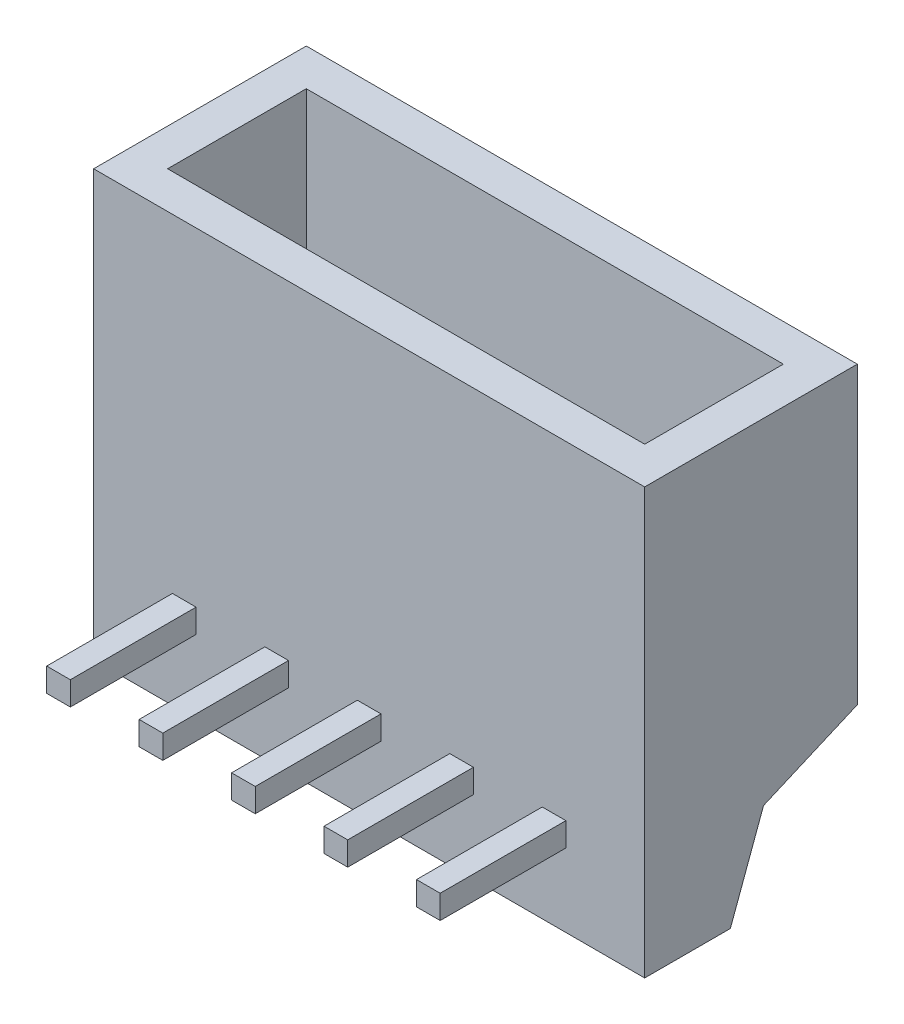
ISO-10303-21;
HEADER;
FILE_DESCRIPTION(('STEP AP214'),'2;1');
FILE_NAME('part.step','',(''),(''),'','','');
FILE_SCHEMA(('AUTOMOTIVE_DESIGN { 1 0 10303 214 1 1 1 1 }'));
ENDSEC;
DATA;
#1=APPLICATION_CONTEXT('core data for automotive mechanical design processes');
#2=APPLICATION_PROTOCOL_DEFINITION('international standard','automotive_design',2000,#1);
#3=PRODUCT_CONTEXT('',#1,'mechanical');
#4=PRODUCT('Part','Part','',(#3));
#5=PRODUCT_RELATED_PRODUCT_CATEGORY('part','',(#4));
#6=PRODUCT_DEFINITION_FORMATION('','',#4);
#7=PRODUCT_DEFINITION_CONTEXT('part definition',#1,'design');
#8=PRODUCT_DEFINITION('design','',#6,#7);
#9=PRODUCT_DEFINITION_SHAPE('','',#8);
#10=(LENGTH_UNIT() NAMED_UNIT(*) SI_UNIT(.MILLI.,.METRE.));
#11=(NAMED_UNIT(*) PLANE_ANGLE_UNIT() SI_UNIT($,.RADIAN.));
#12=(NAMED_UNIT(*) SI_UNIT($,.STERADIAN.) SOLID_ANGLE_UNIT());
#13=UNCERTAINTY_MEASURE_WITH_UNIT(LENGTH_MEASURE(1.E-05),#10,'distance_accuracy_value','');
#14=(GEOMETRIC_REPRESENTATION_CONTEXT(3) GLOBAL_UNCERTAINTY_ASSIGNED_CONTEXT((#13)) GLOBAL_UNIT_ASSIGNED_CONTEXT((#10,
#11,#12)) REPRESENTATION_CONTEXT('',''));
#15=CARTESIAN_POINT('',(0.,0.,0.));
#16=DIRECTION('',(0.,0.,1.));
#17=DIRECTION('',(1.,0.,0.));
#18=AXIS2_PLACEMENT_3D('',#15,#16,#17);
#19=CARTESIAN_POINT('',(0.,0.,5.75));
#20=DIRECTION('',(0.,0.,-1.));
#21=DIRECTION('',(-1.,0.,0.));
#22=AXIS2_PLACEMENT_3D('',#19,#20,#21);
#23=PLANE('',#22);
#24=DIRECTION('',(0.,-1.,0.));
#25=VECTOR('',#24,1.);
#26=CARTESIAN_POINT('',(9.63,1.98,5.75));
#27=LINE('',#26,#25);
#28=CARTESIAN_POINT('',(9.63,2.62,5.75));
#29=VERTEX_POINT('',#28);
#30=CARTESIAN_POINT('',(9.63,1.98,5.75));
#31=VERTEX_POINT('',#30);
#32=EDGE_CURVE('E318',#29,#31,#27,.T.);
#33=ORIENTED_EDGE('',*,*,#32,.F.);
#34=DIRECTION('',(-1.,0.,0.));
#35=VECTOR('',#34,1.);
#36=CARTESIAN_POINT('',(9.63,2.62,5.75));
#37=LINE('',#36,#35);
#38=CARTESIAN_POINT('',(10.27,2.62,5.75));
#39=VERTEX_POINT('',#38);
#40=EDGE_CURVE('E323',#39,#29,#37,.T.);
#41=ORIENTED_EDGE('',*,*,#40,.F.);
#42=DIRECTION('',(0.,1.,0.));
#43=VECTOR('',#42,1.);
#44=CARTESIAN_POINT('',(10.27,1.98,5.75));
#45=LINE('',#44,#43);
#46=CARTESIAN_POINT('',(10.27,1.98,5.75));
#47=VERTEX_POINT('',#46);
#48=EDGE_CURVE('E335',#47,#39,#45,.T.);
#49=ORIENTED_EDGE('',*,*,#48,.F.);
#50=DIRECTION('',(1.,0.,0.));
#51=VECTOR('',#50,1.);
#52=CARTESIAN_POINT('',(9.63,1.98,5.75));
#53=LINE('',#52,#51);
#54=EDGE_CURVE('E332',#31,#47,#53,.T.);
#55=ORIENTED_EDGE('',*,*,#54,.F.);
#56=EDGE_LOOP('',(#33,#41,#49,#55));
#57=FACE_BOUND('',#56,.T.);
#58=DIRECTION('',(0.,-1.,0.));
#59=VECTOR('',#58,1.);
#60=CARTESIAN_POINT('',(4.63,1.98,5.75));
#61=LINE('',#60,#59);
#62=CARTESIAN_POINT('',(4.63,2.62,5.75));
#63=VERTEX_POINT('',#62);
#64=CARTESIAN_POINT('',(4.63,1.98,5.75));
#65=VERTEX_POINT('',#64);
#66=EDGE_CURVE('E384',#63,#65,#61,.T.);
#67=ORIENTED_EDGE('',*,*,#66,.F.);
#68=DIRECTION('',(-1.,0.,0.));
#69=VECTOR('',#68,1.);
#70=CARTESIAN_POINT('',(4.63,2.62,5.75));
#71=LINE('',#70,#69);
#72=CARTESIAN_POINT('',(5.27,2.62,5.75));
#73=VERTEX_POINT('',#72);
#74=EDGE_CURVE('E389',#73,#63,#71,.T.);
#75=ORIENTED_EDGE('',*,*,#74,.F.);
#76=DIRECTION('',(0.,1.,0.));
#77=VECTOR('',#76,1.);
#78=CARTESIAN_POINT('',(5.27,1.98,5.75));
#79=LINE('',#78,#77);
#80=CARTESIAN_POINT('',(5.27,1.98,5.75));
#81=VERTEX_POINT('',#80);
#82=EDGE_CURVE('E401',#81,#73,#79,.T.);
#83=ORIENTED_EDGE('',*,*,#82,.F.);
#84=DIRECTION('',(1.,0.,0.));
#85=VECTOR('',#84,1.);
#86=CARTESIAN_POINT('',(4.63,1.98,5.75));
#87=LINE('',#86,#85);
#88=EDGE_CURVE('E398',#65,#81,#87,.T.);
#89=ORIENTED_EDGE('',*,*,#88,.F.);
#90=EDGE_LOOP('',(#67,#75,#83,#89));
#91=FACE_BOUND('',#90,.T.);
#92=DIRECTION('',(0.,-1.,0.));
#93=VECTOR('',#92,1.);
#94=CARTESIAN_POINT('',(0.,0.,5.75));
#95=LINE('',#94,#93);
#96=CARTESIAN_POINT('',(0.,11.5,5.75));
#97=VERTEX_POINT('',#96);
#98=CARTESIAN_POINT('',(0.,0.,5.75));
#99=VERTEX_POINT('',#98);
#100=EDGE_CURVE('E451',#97,#99,#95,.T.);
#101=ORIENTED_EDGE('',*,*,#100,.T.);
#102=DIRECTION('',(1.,0.,0.));
#103=VECTOR('',#102,1.);
#104=CARTESIAN_POINT('',(0.,0.,5.75));
#105=LINE('',#104,#103);
#106=CARTESIAN_POINT('',(14.9,0.,5.75));
#107=VERTEX_POINT('',#106);
#108=EDGE_CURVE('E454',#99,#107,#105,.T.);
#109=ORIENTED_EDGE('',*,*,#108,.T.);
#110=DIRECTION('',(0.,1.,0.));
#111=VECTOR('',#110,1.);
#112=CARTESIAN_POINT('',(14.9,0.,5.75));
#113=LINE('',#112,#111);
#114=CARTESIAN_POINT('',(14.9,11.5,5.75));
#115=VERTEX_POINT('',#114);
#116=EDGE_CURVE('E457',#107,#115,#113,.T.);
#117=ORIENTED_EDGE('',*,*,#116,.T.);
#118=DIRECTION('',(-1.,0.,0.));
#119=VECTOR('',#118,1.);
#120=CARTESIAN_POINT('',(0.,11.5,5.75));
#121=LINE('',#120,#119);
#122=EDGE_CURVE('E459',#115,#97,#121,.T.);
#123=ORIENTED_EDGE('',*,*,#122,.T.);
#124=EDGE_LOOP('',(#101,#109,#117,#123));
#125=FACE_BOUND('',#124,.T.);
#126=DIRECTION('',(0.,-1.,0.));
#127=VECTOR('',#126,1.);
#128=CARTESIAN_POINT('',(2.13,1.98,5.75));
#129=LINE('',#128,#127);
#130=CARTESIAN_POINT('',(2.13,2.62,5.75));
#131=VERTEX_POINT('',#130);
#132=CARTESIAN_POINT('',(2.13,1.98,5.75));
#133=VERTEX_POINT('',#132);
#134=EDGE_CURVE('E417',#131,#133,#129,.T.);
#135=ORIENTED_EDGE('',*,*,#134,.F.);
#136=DIRECTION('',(-1.,0.,0.));
#137=VECTOR('',#136,1.);
#138=CARTESIAN_POINT('',(2.13,2.62,5.75));
#139=LINE('',#138,#137);
#140=CARTESIAN_POINT('',(2.77,2.62,5.75));
#141=VERTEX_POINT('',#140);
#142=EDGE_CURVE('E422',#141,#131,#139,.T.);
#143=ORIENTED_EDGE('',*,*,#142,.F.);
#144=DIRECTION('',(0.,1.,0.));
#145=VECTOR('',#144,1.);
#146=CARTESIAN_POINT('',(2.77,1.98,5.75));
#147=LINE('',#146,#145);
#148=CARTESIAN_POINT('',(2.77,1.98,5.75));
#149=VERTEX_POINT('',#148);
#150=EDGE_CURVE('E434',#149,#141,#147,.T.);
#151=ORIENTED_EDGE('',*,*,#150,.F.);
#152=DIRECTION('',(1.,0.,0.));
#153=VECTOR('',#152,1.);
#154=CARTESIAN_POINT('',(2.13,1.98,5.75));
#155=LINE('',#154,#153);
#156=EDGE_CURVE('E431',#133,#149,#155,.T.);
#157=ORIENTED_EDGE('',*,*,#156,.F.);
#158=EDGE_LOOP('',(#135,#143,#151,#157));
#159=FACE_BOUND('',#158,.T.);
#160=DIRECTION('',(0.,-1.,0.));
#161=VECTOR('',#160,1.);
#162=CARTESIAN_POINT('',(7.13,1.98,5.75));
#163=LINE('',#162,#161);
#164=CARTESIAN_POINT('',(7.13,2.62,5.75));
#165=VERTEX_POINT('',#164);
#166=CARTESIAN_POINT('',(7.13,1.98,5.75));
#167=VERTEX_POINT('',#166);
#168=EDGE_CURVE('E351',#165,#167,#163,.T.);
#169=ORIENTED_EDGE('',*,*,#168,.F.);
#170=DIRECTION('',(-1.,0.,0.));
#171=VECTOR('',#170,1.);
#172=CARTESIAN_POINT('',(7.13,2.62,5.75));
#173=LINE('',#172,#171);
#174=CARTESIAN_POINT('',(7.77,2.62,5.75));
#175=VERTEX_POINT('',#174);
#176=EDGE_CURVE('E356',#175,#165,#173,.T.);
#177=ORIENTED_EDGE('',*,*,#176,.F.);
#178=DIRECTION('',(0.,1.,0.));
#179=VECTOR('',#178,1.);
#180=CARTESIAN_POINT('',(7.77,1.98,5.75));
#181=LINE('',#180,#179);
#182=CARTESIAN_POINT('',(7.77,1.98,5.75));
#183=VERTEX_POINT('',#182);
#184=EDGE_CURVE('E368',#183,#175,#181,.T.);
#185=ORIENTED_EDGE('',*,*,#184,.F.);
#186=DIRECTION('',(1.,0.,0.));
#187=VECTOR('',#186,1.);
#188=CARTESIAN_POINT('',(7.13,1.98,5.75));
#189=LINE('',#188,#187);
#190=EDGE_CURVE('E365',#167,#183,#189,.T.);
#191=ORIENTED_EDGE('',*,*,#190,.F.);
#192=EDGE_LOOP('',(#169,#177,#185,#191));
#193=FACE_BOUND('',#192,.T.);
#194=DIRECTION('',(0.,-1.,0.));
#195=VECTOR('',#194,1.);
#196=CARTESIAN_POINT('',(12.13,1.98,5.75));
#197=LINE('',#196,#195);
#198=CARTESIAN_POINT('',(12.13,2.62,5.75));
#199=VERTEX_POINT('',#198);
#200=CARTESIAN_POINT('',(12.13,1.98,5.75));
#201=VERTEX_POINT('',#200);
#202=EDGE_CURVE('E282',#199,#201,#197,.T.);
#203=ORIENTED_EDGE('',*,*,#202,.F.);
#204=DIRECTION('',(-1.,0.,0.));
#205=VECTOR('',#204,1.);
#206=CARTESIAN_POINT('',(12.13,2.62,5.75));
#207=LINE('',#206,#205);
#208=CARTESIAN_POINT('',(12.77,2.62,5.75));
#209=VERTEX_POINT('',#208);
#210=EDGE_CURVE('E290',#209,#199,#207,.T.);
#211=ORIENTED_EDGE('',*,*,#210,.F.);
#212=DIRECTION('',(0.,1.,0.));
#213=VECTOR('',#212,1.);
#214=CARTESIAN_POINT('',(12.77,1.98,5.75));
#215=LINE('',#214,#213);
#216=CARTESIAN_POINT('',(12.77,1.98,5.75));
#217=VERTEX_POINT('',#216);
#218=EDGE_CURVE('E302',#217,#209,#215,.T.);
#219=ORIENTED_EDGE('',*,*,#218,.F.);
#220=DIRECTION('',(1.,0.,0.));
#221=VECTOR('',#220,1.);
#222=CARTESIAN_POINT('',(12.13,1.98,5.75));
#223=LINE('',#222,#221);
#224=EDGE_CURVE('E299',#201,#217,#223,.T.);
#225=ORIENTED_EDGE('',*,*,#224,.F.);
#226=EDGE_LOOP('',(#203,#211,#219,#225));
#227=FACE_BOUND('',#226,.T.);
#228=ADVANCED_FACE('F34',(#57,#91,#125,#159,#193,#227),#23,.F.);
#229=CARTESIAN_POINT('',(0.,0.,5.75));
#230=DIRECTION('',(1.,0.,0.));
#231=DIRECTION('',(0.,0.,-1.));
#232=AXIS2_PLACEMENT_3D('',#229,#230,#231);
#233=PLANE('',#232);
#234=DIRECTION('',(0.,-1.,0.));
#235=VECTOR('',#234,1.);
#236=CARTESIAN_POINT('',(0.,0.,0.));
#237=LINE('',#236,#235);
#238=CARTESIAN_POINT('',(0.,11.5,0.));
#239=VERTEX_POINT('',#238);
#240=CARTESIAN_POINT('',(0.,3.52380686471601,0.));
#241=VERTEX_POINT('',#240);
#242=EDGE_CURVE('E450',#239,#241,#237,.T.);
#243=ORIENTED_EDGE('',*,*,#242,.T.);
#244=DIRECTION('',(0.,0.395661660405739,-0.918396347164433));
#245=VECTOR('',#244,1.);
#246=CARTESIAN_POINT('',(0.,3.52380686471601,0.));
#247=LINE('',#246,#245);
#248=CARTESIAN_POINT('',(0.,2.43109668109673,2.53636159772523));
#249=VERTEX_POINT('',#248);
#250=EDGE_CURVE('E57',#249,#241,#247,.T.);
#251=ORIENTED_EDGE('',*,*,#250,.F.);
#252=DIRECTION('',(0.,0.938176049237479,-0.346158490632768));
#253=VECTOR('',#252,1.);
#254=CARTESIAN_POINT('',(0.,2.43109668109673,2.53636159772523));
#255=LINE('',#254,#253);
#256=CARTESIAN_POINT('',(0.,0.,3.43336249472613));
#257=VERTEX_POINT('',#256);
#258=EDGE_CURVE('E266',#257,#249,#255,.T.);
#259=ORIENTED_EDGE('',*,*,#258,.F.);
#260=DIRECTION('',(0.,0.,-1.));
#261=VECTOR('',#260,1.);
#262=CARTESIAN_POINT('',(0.,0.,5.75));
#263=LINE('',#262,#261);
#264=EDGE_CURVE('E11',#99,#257,#263,.T.);
#265=ORIENTED_EDGE('',*,*,#264,.F.);
#266=ORIENTED_EDGE('',*,*,#100,.F.);
#267=DIRECTION('',(0.,0.,-1.));
#268=VECTOR('',#267,1.);
#269=CARTESIAN_POINT('',(0.,11.5,5.75));
#270=LINE('',#269,#268);
#271=EDGE_CURVE('E461',#97,#239,#270,.T.);
#272=ORIENTED_EDGE('',*,*,#271,.T.);
#273=EDGE_LOOP('',(#243,#251,#259,#265,#266,#272));
#274=FACE_BOUND('',#273,.T.);
#275=ADVANCED_FACE('F36',(#274),#233,.F.);
#276=CARTESIAN_POINT('',(0.,0.,5.75));
#277=DIRECTION('',(0.,1.,0.));
#278=DIRECTION('',(0.,0.,1.));
#279=AXIS2_PLACEMENT_3D('',#276,#277,#278);
#280=PLANE('',#279);
#281=ORIENTED_EDGE('',*,*,#264,.T.);
#282=DIRECTION('',(-1.,0.,0.));
#283=VECTOR('',#282,1.);
#284=CARTESIAN_POINT('',(14.9,0.,3.43336249472613));
#285=LINE('',#284,#283);
#286=CARTESIAN_POINT('',(14.9,0.,3.43336249472613));
#287=VERTEX_POINT('',#286);
#288=EDGE_CURVE('E276',#287,#257,#285,.T.);
#289=ORIENTED_EDGE('',*,*,#288,.F.);
#290=DIRECTION('',(0.,0.,-1.));
#291=VECTOR('',#290,1.);
#292=CARTESIAN_POINT('',(14.9,0.,5.75));
#293=LINE('',#292,#291);
#294=EDGE_CURVE('E42',#107,#287,#293,.T.);
#295=ORIENTED_EDGE('',*,*,#294,.F.);
#296=ORIENTED_EDGE('',*,*,#108,.F.);
#297=EDGE_LOOP('',(#281,#289,#295,#296));
#298=FACE_BOUND('',#297,.T.);
#299=ADVANCED_FACE('F479',(#298),#280,.F.);
#300=CARTESIAN_POINT('',(14.9,0.,5.75));
#301=DIRECTION('',(-1.,0.,0.));
#302=DIRECTION('',(0.,0.,1.));
#303=AXIS2_PLACEMENT_3D('',#300,#301,#302);
#304=PLANE('',#303);
#305=DIRECTION('',(0.,0.938176049237479,-0.346158490632768));
#306=VECTOR('',#305,1.);
#307=CARTESIAN_POINT('',(14.9,2.43109668109673,2.53636159772523));
#308=LINE('',#307,#306);
#309=CARTESIAN_POINT('',(14.9,2.43109668109673,2.53636159772523));
#310=VERTEX_POINT('',#309);
#311=EDGE_CURVE('E270',#287,#310,#308,.T.);
#312=ORIENTED_EDGE('',*,*,#311,.T.);
#313=DIRECTION('',(0.,0.395661660405739,-0.918396347164433));
#314=VECTOR('',#313,1.);
#315=CARTESIAN_POINT('',(14.9,3.52380686471601,0.));
#316=LINE('',#315,#314);
#317=CARTESIAN_POINT('',(14.9,3.52380686471601,0.));
#318=VERTEX_POINT('',#317);
#319=EDGE_CURVE('E273',#310,#318,#316,.T.);
#320=ORIENTED_EDGE('',*,*,#319,.T.);
#321=DIRECTION('',(0.,1.,0.));
#322=VECTOR('',#321,1.);
#323=CARTESIAN_POINT('',(14.9,0.,0.));
#324=LINE('',#323,#322);
#325=CARTESIAN_POINT('',(14.9,11.5,0.));
#326=VERTEX_POINT('',#325);
#327=EDGE_CURVE('E464',#318,#326,#324,.T.);
#328=ORIENTED_EDGE('',*,*,#327,.T.);
#329=DIRECTION('',(0.,0.,-1.));
#330=VECTOR('',#329,1.);
#331=CARTESIAN_POINT('',(14.9,11.5,5.75));
#332=LINE('',#331,#330);
#333=EDGE_CURVE('E469',#115,#326,#332,.T.);
#334=ORIENTED_EDGE('',*,*,#333,.F.);
#335=ORIENTED_EDGE('',*,*,#116,.F.);
#336=ORIENTED_EDGE('',*,*,#294,.T.);
#337=EDGE_LOOP('',(#312,#320,#328,#334,#335,#336));
#338=FACE_BOUND('',#337,.T.);
#339=ADVANCED_FACE('F475',(#338),#304,.F.);
#340=CARTESIAN_POINT('',(0.,11.5,5.75));
#341=DIRECTION('',(0.,-1.,0.));
#342=DIRECTION('',(0.,0.,-1.));
#343=AXIS2_PLACEMENT_3D('',#340,#341,#342);
#344=PLANE('',#343);
#345=DIRECTION('',(-1.,0.,0.));
#346=VECTOR('',#345,1.);
#347=CARTESIAN_POINT('',(13.9,11.5,1.));
#348=LINE('',#347,#346);
#349=CARTESIAN_POINT('',(13.9,11.5,1.));
#350=VERTEX_POINT('',#349);
#351=CARTESIAN_POINT('',(1.,11.5,1.));
#352=VERTEX_POINT('',#351);
#353=EDGE_CURVE('E260',#350,#352,#348,.T.);
#354=ORIENTED_EDGE('',*,*,#353,.F.);
#355=DIRECTION('',(0.,0.,-1.));
#356=VECTOR('',#355,1.);
#357=CARTESIAN_POINT('',(13.9,11.5,4.75));
#358=LINE('',#357,#356);
#359=CARTESIAN_POINT('',(13.9,11.5,4.75));
#360=VERTEX_POINT('',#359);
#361=EDGE_CURVE('E49',#360,#350,#358,.T.);
#362=ORIENTED_EDGE('',*,*,#361,.F.);
#363=DIRECTION('',(1.,0.,0.));
#364=VECTOR('',#363,1.);
#365=CARTESIAN_POINT('',(1.,11.5,4.75));
#366=LINE('',#365,#364);
#367=CARTESIAN_POINT('',(1.,11.5,4.75));
#368=VERTEX_POINT('',#367);
#369=EDGE_CURVE('E251',#368,#360,#366,.T.);
#370=ORIENTED_EDGE('',*,*,#369,.F.);
#371=DIRECTION('',(0.,0.,1.));
#372=VECTOR('',#371,1.);
#373=CARTESIAN_POINT('',(1.,11.5,1.));
#374=LINE('',#373,#372);
#375=EDGE_CURVE('E254',#352,#368,#374,.T.);
#376=ORIENTED_EDGE('',*,*,#375,.F.);
#377=EDGE_LOOP('',(#354,#362,#370,#376));
#378=FACE_BOUND('',#377,.T.);
#379=DIRECTION('',(-1.,0.,0.));
#380=VECTOR('',#379,1.);
#381=CARTESIAN_POINT('',(0.,11.5,0.));
#382=LINE('',#381,#380);
#383=EDGE_CURVE('E455',#326,#239,#382,.T.);
#384=ORIENTED_EDGE('',*,*,#383,.T.);
#385=ORIENTED_EDGE('',*,*,#271,.F.);
#386=ORIENTED_EDGE('',*,*,#122,.F.);
#387=ORIENTED_EDGE('',*,*,#333,.T.);
#388=EDGE_LOOP('',(#384,#385,#386,#387));
#389=FACE_BOUND('',#388,.T.);
#390=ADVANCED_FACE('F496',(#378,#389),#344,.F.);
#391=CARTESIAN_POINT('',(0.,0.,0.));
#392=DIRECTION('',(0.,0.,-1.));
#393=DIRECTION('',(-1.,0.,0.));
#394=AXIS2_PLACEMENT_3D('',#391,#392,#393);
#395=PLANE('',#394);
#396=DIRECTION('',(-1.,0.,0.));
#397=VECTOR('',#396,1.);
#398=CARTESIAN_POINT('',(14.9,3.52380686471601,0.));
#399=LINE('',#398,#397);
#400=EDGE_CURVE('E280',#318,#241,#399,.T.);
#401=ORIENTED_EDGE('',*,*,#400,.T.);
#402=ORIENTED_EDGE('',*,*,#242,.F.);
#403=ORIENTED_EDGE('',*,*,#383,.F.);
#404=ORIENTED_EDGE('',*,*,#327,.F.);
#405=EDGE_LOOP('',(#401,#402,#403,#404));
#406=FACE_BOUND('',#405,.T.);
#407=ADVANCED_FACE('F490',(#406),#395,.T.);
#408=CARTESIAN_POINT('',(2.13,1.98,9.15));
#409=DIRECTION('',(1.,0.,0.));
#410=DIRECTION('',(0.,0.,-1.));
#411=AXIS2_PLACEMENT_3D('',#408,#409,#410);
#412=PLANE('',#411);
#413=ORIENTED_EDGE('',*,*,#134,.T.);
#414=DIRECTION('',(0.,0.,-1.));
#415=VECTOR('',#414,1.);
#416=CARTESIAN_POINT('',(2.13,1.98,9.15));
#417=LINE('',#416,#415);
#418=CARTESIAN_POINT('',(2.13,1.98,9.15));
#419=VERTEX_POINT('',#418);
#420=EDGE_CURVE('E447',#419,#133,#417,.T.);
#421=ORIENTED_EDGE('',*,*,#420,.F.);
#422=DIRECTION('',(0.,-1.,0.));
#423=VECTOR('',#422,1.);
#424=CARTESIAN_POINT('',(2.13,1.98,9.15));
#425=LINE('',#424,#423);
#426=CARTESIAN_POINT('',(2.13,2.62,9.15));
#427=VERTEX_POINT('',#426);
#428=EDGE_CURVE('E418',#427,#419,#425,.T.);
#429=ORIENTED_EDGE('',*,*,#428,.F.);
#430=DIRECTION('',(0.,0.,-1.));
#431=VECTOR('',#430,1.);
#432=CARTESIAN_POINT('',(2.13,2.62,9.15));
#433=LINE('',#432,#431);
#434=EDGE_CURVE('E428',#427,#131,#433,.T.);
#435=ORIENTED_EDGE('',*,*,#434,.T.);
#436=EDGE_LOOP('',(#413,#421,#429,#435));
#437=FACE_BOUND('',#436,.T.);
#438=ADVANCED_FACE('F606',(#437),#412,.F.);
#439=CARTESIAN_POINT('',(2.13,1.98,9.15));
#440=DIRECTION('',(0.,1.,0.));
#441=DIRECTION('',(-1.,0.,0.));
#442=AXIS2_PLACEMENT_3D('',#439,#440,#441);
#443=PLANE('',#442);
#444=ORIENTED_EDGE('',*,*,#156,.T.);
#445=DIRECTION('',(0.,0.,-1.));
#446=VECTOR('',#445,1.);
#447=CARTESIAN_POINT('',(2.77,1.98,9.15));
#448=LINE('',#447,#446);
#449=CARTESIAN_POINT('',(2.77,1.98,9.15));
#450=VERTEX_POINT('',#449);
#451=EDGE_CURVE('E444',#450,#149,#448,.T.);
#452=ORIENTED_EDGE('',*,*,#451,.F.);
#453=DIRECTION('',(1.,0.,0.));
#454=VECTOR('',#453,1.);
#455=CARTESIAN_POINT('',(2.13,1.98,9.15));
#456=LINE('',#455,#454);
#457=EDGE_CURVE('E421',#419,#450,#456,.T.);
#458=ORIENTED_EDGE('',*,*,#457,.F.);
#459=ORIENTED_EDGE('',*,*,#420,.T.);
#460=EDGE_LOOP('',(#444,#452,#458,#459));
#461=FACE_BOUND('',#460,.T.);
#462=ADVANCED_FACE('F602',(#461),#443,.F.);
#463=CARTESIAN_POINT('',(2.77,1.98,9.15));
#464=DIRECTION('',(-1.,0.,0.));
#465=DIRECTION('',(0.,0.,1.));
#466=AXIS2_PLACEMENT_3D('',#463,#464,#465);
#467=PLANE('',#466);
#468=ORIENTED_EDGE('',*,*,#150,.T.);
#469=DIRECTION('',(0.,0.,-1.));
#470=VECTOR('',#469,1.);
#471=CARTESIAN_POINT('',(2.77,2.62,9.15));
#472=LINE('',#471,#470);
#473=CARTESIAN_POINT('',(2.77,2.62,9.15));
#474=VERTEX_POINT('',#473);
#475=EDGE_CURVE('E441',#474,#141,#472,.T.);
#476=ORIENTED_EDGE('',*,*,#475,.F.);
#477=DIRECTION('',(0.,1.,0.));
#478=VECTOR('',#477,1.);
#479=CARTESIAN_POINT('',(2.77,1.98,9.15));
#480=LINE('',#479,#478);
#481=EDGE_CURVE('E424',#450,#474,#480,.T.);
#482=ORIENTED_EDGE('',*,*,#481,.F.);
#483=ORIENTED_EDGE('',*,*,#451,.T.);
#484=EDGE_LOOP('',(#468,#476,#482,#483));
#485=FACE_BOUND('',#484,.T.);
#486=ADVANCED_FACE('F598',(#485),#467,.F.);
#487=CARTESIAN_POINT('',(2.13,2.62,9.15));
#488=DIRECTION('',(0.,-1.,0.));
#489=DIRECTION('',(1.,0.,0.));
#490=AXIS2_PLACEMENT_3D('',#487,#488,#489);
#491=PLANE('',#490);
#492=ORIENTED_EDGE('',*,*,#142,.T.);
#493=ORIENTED_EDGE('',*,*,#434,.F.);
#494=DIRECTION('',(-1.,0.,0.));
#495=VECTOR('',#494,1.);
#496=CARTESIAN_POINT('',(2.13,2.62,9.15));
#497=LINE('',#496,#495);
#498=EDGE_CURVE('E426',#474,#427,#497,.T.);
#499=ORIENTED_EDGE('',*,*,#498,.F.);
#500=ORIENTED_EDGE('',*,*,#475,.T.);
#501=EDGE_LOOP('',(#492,#493,#499,#500));
#502=FACE_BOUND('',#501,.T.);
#503=ADVANCED_FACE('F594',(#502),#491,.F.);
#504=CARTESIAN_POINT('',(0.,0.,9.15));
#505=DIRECTION('',(0.,0.,-1.));
#506=DIRECTION('',(-1.,0.,0.));
#507=AXIS2_PLACEMENT_3D('',#504,#505,#506);
#508=PLANE('',#507);
#509=ORIENTED_EDGE('',*,*,#428,.T.);
#510=ORIENTED_EDGE('',*,*,#457,.T.);
#511=ORIENTED_EDGE('',*,*,#481,.T.);
#512=ORIENTED_EDGE('',*,*,#498,.T.);
#513=EDGE_LOOP('',(#509,#510,#511,#512));
#514=FACE_BOUND('',#513,.T.);
#515=ADVANCED_FACE('F590',(#514),#508,.F.);
#516=CARTESIAN_POINT('',(4.63,1.98,9.15));
#517=DIRECTION('',(1.,0.,0.));
#518=DIRECTION('',(0.,0.,-1.));
#519=AXIS2_PLACEMENT_3D('',#516,#517,#518);
#520=PLANE('',#519);
#521=ORIENTED_EDGE('',*,*,#66,.T.);
#522=DIRECTION('',(0.,0.,-1.));
#523=VECTOR('',#522,1.);
#524=CARTESIAN_POINT('',(4.63,1.98,9.15));
#525=LINE('',#524,#523);
#526=CARTESIAN_POINT('',(4.63,1.98,9.15));
#527=VERTEX_POINT('',#526);
#528=EDGE_CURVE('E414',#527,#65,#525,.T.);
#529=ORIENTED_EDGE('',*,*,#528,.F.);
#530=DIRECTION('',(0.,-1.,0.));
#531=VECTOR('',#530,1.);
#532=CARTESIAN_POINT('',(4.63,1.98,9.15));
#533=LINE('',#532,#531);
#534=CARTESIAN_POINT('',(4.63,2.62,9.15));
#535=VERTEX_POINT('',#534);
#536=EDGE_CURVE('E385',#535,#527,#533,.T.);
#537=ORIENTED_EDGE('',*,*,#536,.F.);
#538=DIRECTION('',(0.,0.,-1.));
#539=VECTOR('',#538,1.);
#540=CARTESIAN_POINT('',(4.63,2.62,9.15));
#541=LINE('',#540,#539);
#542=EDGE_CURVE('E395',#535,#63,#541,.T.);
#543=ORIENTED_EDGE('',*,*,#542,.T.);
#544=EDGE_LOOP('',(#521,#529,#537,#543));
#545=FACE_BOUND('',#544,.T.);
#546=ADVANCED_FACE('F586',(#545),#520,.F.);
#547=CARTESIAN_POINT('',(4.63,1.98,9.15));
#548=DIRECTION('',(0.,1.,0.));
#549=DIRECTION('',(-1.,0.,0.));
#550=AXIS2_PLACEMENT_3D('',#547,#548,#549);
#551=PLANE('',#550);
#552=ORIENTED_EDGE('',*,*,#88,.T.);
#553=DIRECTION('',(0.,0.,-1.));
#554=VECTOR('',#553,1.);
#555=CARTESIAN_POINT('',(5.27,1.98,9.15));
#556=LINE('',#555,#554);
#557=CARTESIAN_POINT('',(5.27,1.98,9.15));
#558=VERTEX_POINT('',#557);
#559=EDGE_CURVE('E411',#558,#81,#556,.T.);
#560=ORIENTED_EDGE('',*,*,#559,.F.);
#561=DIRECTION('',(1.,0.,0.));
#562=VECTOR('',#561,1.);
#563=CARTESIAN_POINT('',(4.63,1.98,9.15));
#564=LINE('',#563,#562);
#565=EDGE_CURVE('E388',#527,#558,#564,.T.);
#566=ORIENTED_EDGE('',*,*,#565,.F.);
#567=ORIENTED_EDGE('',*,*,#528,.T.);
#568=EDGE_LOOP('',(#552,#560,#566,#567));
#569=FACE_BOUND('',#568,.T.);
#570=ADVANCED_FACE('F582',(#569),#551,.F.);
#571=CARTESIAN_POINT('',(5.27,1.98,9.15));
#572=DIRECTION('',(-1.,0.,0.));
#573=DIRECTION('',(0.,0.,1.));
#574=AXIS2_PLACEMENT_3D('',#571,#572,#573);
#575=PLANE('',#574);
#576=ORIENTED_EDGE('',*,*,#82,.T.);
#577=DIRECTION('',(0.,0.,-1.));
#578=VECTOR('',#577,1.);
#579=CARTESIAN_POINT('',(5.27,2.62,9.15));
#580=LINE('',#579,#578);
#581=CARTESIAN_POINT('',(5.27,2.62,9.15));
#582=VERTEX_POINT('',#581);
#583=EDGE_CURVE('E408',#582,#73,#580,.T.);
#584=ORIENTED_EDGE('',*,*,#583,.F.);
#585=DIRECTION('',(0.,1.,0.));
#586=VECTOR('',#585,1.);
#587=CARTESIAN_POINT('',(5.27,1.98,9.15));
#588=LINE('',#587,#586);
#589=EDGE_CURVE('E391',#558,#582,#588,.T.);
#590=ORIENTED_EDGE('',*,*,#589,.F.);
#591=ORIENTED_EDGE('',*,*,#559,.T.);
#592=EDGE_LOOP('',(#576,#584,#590,#591));
#593=FACE_BOUND('',#592,.T.);
#594=ADVANCED_FACE('F578',(#593),#575,.F.);
#595=CARTESIAN_POINT('',(4.63,2.62,9.15));
#596=DIRECTION('',(0.,-1.,0.));
#597=DIRECTION('',(1.,0.,0.));
#598=AXIS2_PLACEMENT_3D('',#595,#596,#597);
#599=PLANE('',#598);
#600=ORIENTED_EDGE('',*,*,#74,.T.);
#601=ORIENTED_EDGE('',*,*,#542,.F.);
#602=DIRECTION('',(-1.,0.,0.));
#603=VECTOR('',#602,1.);
#604=CARTESIAN_POINT('',(4.63,2.62,9.15));
#605=LINE('',#604,#603);
#606=EDGE_CURVE('E393',#582,#535,#605,.T.);
#607=ORIENTED_EDGE('',*,*,#606,.F.);
#608=ORIENTED_EDGE('',*,*,#583,.T.);
#609=EDGE_LOOP('',(#600,#601,#607,#608));
#610=FACE_BOUND('',#609,.T.);
#611=ADVANCED_FACE('F574',(#610),#599,.F.);
#612=CARTESIAN_POINT('',(0.,0.,9.15));
#613=DIRECTION('',(0.,0.,-1.));
#614=DIRECTION('',(-1.,0.,0.));
#615=AXIS2_PLACEMENT_3D('',#612,#613,#614);
#616=PLANE('',#615);
#617=ORIENTED_EDGE('',*,*,#536,.T.);
#618=ORIENTED_EDGE('',*,*,#565,.T.);
#619=ORIENTED_EDGE('',*,*,#589,.T.);
#620=ORIENTED_EDGE('',*,*,#606,.T.);
#621=EDGE_LOOP('',(#617,#618,#619,#620));
#622=FACE_BOUND('',#621,.T.);
#623=ADVANCED_FACE('F570',(#622),#616,.F.);
#624=CARTESIAN_POINT('',(7.13,1.98,9.15));
#625=DIRECTION('',(1.,0.,0.));
#626=DIRECTION('',(0.,0.,-1.));
#627=AXIS2_PLACEMENT_3D('',#624,#625,#626);
#628=PLANE('',#627);
#629=ORIENTED_EDGE('',*,*,#168,.T.);
#630=DIRECTION('',(0.,0.,-1.));
#631=VECTOR('',#630,1.);
#632=CARTESIAN_POINT('',(7.13,1.98,9.15));
#633=LINE('',#632,#631);
#634=CARTESIAN_POINT('',(7.13,1.98,9.15));
#635=VERTEX_POINT('',#634);
#636=EDGE_CURVE('E381',#635,#167,#633,.T.);
#637=ORIENTED_EDGE('',*,*,#636,.F.);
#638=DIRECTION('',(0.,-1.,0.));
#639=VECTOR('',#638,1.);
#640=CARTESIAN_POINT('',(7.13,1.98,9.15));
#641=LINE('',#640,#639);
#642=CARTESIAN_POINT('',(7.13,2.62,9.15));
#643=VERTEX_POINT('',#642);
#644=EDGE_CURVE('E352',#643,#635,#641,.T.);
#645=ORIENTED_EDGE('',*,*,#644,.F.);
#646=DIRECTION('',(0.,0.,-1.));
#647=VECTOR('',#646,1.);
#648=CARTESIAN_POINT('',(7.13,2.62,9.15));
#649=LINE('',#648,#647);
#650=EDGE_CURVE('E362',#643,#165,#649,.T.);
#651=ORIENTED_EDGE('',*,*,#650,.T.);
#652=EDGE_LOOP('',(#629,#637,#645,#651));
#653=FACE_BOUND('',#652,.T.);
#654=ADVANCED_FACE('F566',(#653),#628,.F.);
#655=CARTESIAN_POINT('',(7.13,1.98,9.15));
#656=DIRECTION('',(0.,1.,0.));
#657=DIRECTION('',(-1.,0.,0.));
#658=AXIS2_PLACEMENT_3D('',#655,#656,#657);
#659=PLANE('',#658);
#660=ORIENTED_EDGE('',*,*,#190,.T.);
#661=DIRECTION('',(0.,0.,-1.));
#662=VECTOR('',#661,1.);
#663=CARTESIAN_POINT('',(7.77,1.98,9.15));
#664=LINE('',#663,#662);
#665=CARTESIAN_POINT('',(7.77,1.98,9.15));
#666=VERTEX_POINT('',#665);
#667=EDGE_CURVE('E378',#666,#183,#664,.T.);
#668=ORIENTED_EDGE('',*,*,#667,.F.);
#669=DIRECTION('',(1.,0.,0.));
#670=VECTOR('',#669,1.);
#671=CARTESIAN_POINT('',(7.13,1.98,9.15));
#672=LINE('',#671,#670);
#673=EDGE_CURVE('E355',#635,#666,#672,.T.);
#674=ORIENTED_EDGE('',*,*,#673,.F.);
#675=ORIENTED_EDGE('',*,*,#636,.T.);
#676=EDGE_LOOP('',(#660,#668,#674,#675));
#677=FACE_BOUND('',#676,.T.);
#678=ADVANCED_FACE('F562',(#677),#659,.F.);
#679=CARTESIAN_POINT('',(7.77,1.98,9.15));
#680=DIRECTION('',(-1.,0.,0.));
#681=DIRECTION('',(0.,0.,1.));
#682=AXIS2_PLACEMENT_3D('',#679,#680,#681);
#683=PLANE('',#682);
#684=ORIENTED_EDGE('',*,*,#184,.T.);
#685=DIRECTION('',(0.,0.,-1.));
#686=VECTOR('',#685,1.);
#687=CARTESIAN_POINT('',(7.77,2.62,9.15));
#688=LINE('',#687,#686);
#689=CARTESIAN_POINT('',(7.77,2.62,9.15));
#690=VERTEX_POINT('',#689);
#691=EDGE_CURVE('E375',#690,#175,#688,.T.);
#692=ORIENTED_EDGE('',*,*,#691,.F.);
#693=DIRECTION('',(0.,1.,0.));
#694=VECTOR('',#693,1.);
#695=CARTESIAN_POINT('',(7.77,1.98,9.15));
#696=LINE('',#695,#694);
#697=EDGE_CURVE('E358',#666,#690,#696,.T.);
#698=ORIENTED_EDGE('',*,*,#697,.F.);
#699=ORIENTED_EDGE('',*,*,#667,.T.);
#700=EDGE_LOOP('',(#684,#692,#698,#699));
#701=FACE_BOUND('',#700,.T.);
#702=ADVANCED_FACE('F558',(#701),#683,.F.);
#703=CARTESIAN_POINT('',(7.13,2.62,9.15));
#704=DIRECTION('',(0.,-1.,0.));
#705=DIRECTION('',(1.,0.,0.));
#706=AXIS2_PLACEMENT_3D('',#703,#704,#705);
#707=PLANE('',#706);
#708=ORIENTED_EDGE('',*,*,#176,.T.);
#709=ORIENTED_EDGE('',*,*,#650,.F.);
#710=DIRECTION('',(-1.,0.,0.));
#711=VECTOR('',#710,1.);
#712=CARTESIAN_POINT('',(7.13,2.62,9.15));
#713=LINE('',#712,#711);
#714=EDGE_CURVE('E360',#690,#643,#713,.T.);
#715=ORIENTED_EDGE('',*,*,#714,.F.);
#716=ORIENTED_EDGE('',*,*,#691,.T.);
#717=EDGE_LOOP('',(#708,#709,#715,#716));
#718=FACE_BOUND('',#717,.T.);
#719=ADVANCED_FACE('F554',(#718),#707,.F.);
#720=CARTESIAN_POINT('',(0.,0.,9.15));
#721=DIRECTION('',(0.,0.,-1.));
#722=DIRECTION('',(-1.,0.,0.));
#723=AXIS2_PLACEMENT_3D('',#720,#721,#722);
#724=PLANE('',#723);
#725=ORIENTED_EDGE('',*,*,#644,.T.);
#726=ORIENTED_EDGE('',*,*,#673,.T.);
#727=ORIENTED_EDGE('',*,*,#697,.T.);
#728=ORIENTED_EDGE('',*,*,#714,.T.);
#729=EDGE_LOOP('',(#725,#726,#727,#728));
#730=FACE_BOUND('',#729,.T.);
#731=ADVANCED_FACE('F550',(#730),#724,.F.);
#732=CARTESIAN_POINT('',(9.63,1.98,9.15));
#733=DIRECTION('',(1.,0.,0.));
#734=DIRECTION('',(0.,0.,-1.));
#735=AXIS2_PLACEMENT_3D('',#732,#733,#734);
#736=PLANE('',#735);
#737=ORIENTED_EDGE('',*,*,#32,.T.);
#738=DIRECTION('',(0.,0.,-1.));
#739=VECTOR('',#738,1.);
#740=CARTESIAN_POINT('',(9.63,1.98,9.15));
#741=LINE('',#740,#739);
#742=CARTESIAN_POINT('',(9.63,1.98,9.15));
#743=VERTEX_POINT('',#742);
#744=EDGE_CURVE('E348',#743,#31,#741,.T.);
#745=ORIENTED_EDGE('',*,*,#744,.F.);
#746=DIRECTION('',(0.,-1.,0.));
#747=VECTOR('',#746,1.);
#748=CARTESIAN_POINT('',(9.63,1.98,9.15));
#749=LINE('',#748,#747);
#750=CARTESIAN_POINT('',(9.63,2.62,9.15));
#751=VERTEX_POINT('',#750);
#752=EDGE_CURVE('E319',#751,#743,#749,.T.);
#753=ORIENTED_EDGE('',*,*,#752,.F.);
#754=DIRECTION('',(0.,0.,-1.));
#755=VECTOR('',#754,1.);
#756=CARTESIAN_POINT('',(9.63,2.62,9.15));
#757=LINE('',#756,#755);
#758=EDGE_CURVE('E329',#751,#29,#757,.T.);
#759=ORIENTED_EDGE('',*,*,#758,.T.);
#760=EDGE_LOOP('',(#737,#745,#753,#759));
#761=FACE_BOUND('',#760,.T.);
#762=ADVANCED_FACE('F546',(#761),#736,.F.);
#763=CARTESIAN_POINT('',(9.63,1.98,9.15));
#764=DIRECTION('',(0.,1.,0.));
#765=DIRECTION('',(-1.,0.,0.));
#766=AXIS2_PLACEMENT_3D('',#763,#764,#765);
#767=PLANE('',#766);
#768=ORIENTED_EDGE('',*,*,#54,.T.);
#769=DIRECTION('',(0.,0.,-1.));
#770=VECTOR('',#769,1.);
#771=CARTESIAN_POINT('',(10.27,1.98,9.15));
#772=LINE('',#771,#770);
#773=CARTESIAN_POINT('',(10.27,1.98,9.15));
#774=VERTEX_POINT('',#773);
#775=EDGE_CURVE('E345',#774,#47,#772,.T.);
#776=ORIENTED_EDGE('',*,*,#775,.F.);
#777=DIRECTION('',(1.,0.,0.));
#778=VECTOR('',#777,1.);
#779=CARTESIAN_POINT('',(9.63,1.98,9.15));
#780=LINE('',#779,#778);
#781=EDGE_CURVE('E322',#743,#774,#780,.T.);
#782=ORIENTED_EDGE('',*,*,#781,.F.);
#783=ORIENTED_EDGE('',*,*,#744,.T.);
#784=EDGE_LOOP('',(#768,#776,#782,#783));
#785=FACE_BOUND('',#784,.T.);
#786=ADVANCED_FACE('F542',(#785),#767,.F.);
#787=CARTESIAN_POINT('',(10.27,1.98,9.15));
#788=DIRECTION('',(-1.,0.,0.));
#789=DIRECTION('',(0.,0.,1.));
#790=AXIS2_PLACEMENT_3D('',#787,#788,#789);
#791=PLANE('',#790);
#792=ORIENTED_EDGE('',*,*,#48,.T.);
#793=DIRECTION('',(0.,0.,-1.));
#794=VECTOR('',#793,1.);
#795=CARTESIAN_POINT('',(10.27,2.62,9.15));
#796=LINE('',#795,#794);
#797=CARTESIAN_POINT('',(10.27,2.62,9.15));
#798=VERTEX_POINT('',#797);
#799=EDGE_CURVE('E342',#798,#39,#796,.T.);
#800=ORIENTED_EDGE('',*,*,#799,.F.);
#801=DIRECTION('',(0.,1.,0.));
#802=VECTOR('',#801,1.);
#803=CARTESIAN_POINT('',(10.27,1.98,9.15));
#804=LINE('',#803,#802);
#805=EDGE_CURVE('E325',#774,#798,#804,.T.);
#806=ORIENTED_EDGE('',*,*,#805,.F.);
#807=ORIENTED_EDGE('',*,*,#775,.T.);
#808=EDGE_LOOP('',(#792,#800,#806,#807));
#809=FACE_BOUND('',#808,.T.);
#810=ADVANCED_FACE('F538',(#809),#791,.F.);
#811=CARTESIAN_POINT('',(9.63,2.62,9.15));
#812=DIRECTION('',(0.,-1.,0.));
#813=DIRECTION('',(1.,0.,0.));
#814=AXIS2_PLACEMENT_3D('',#811,#812,#813);
#815=PLANE('',#814);
#816=ORIENTED_EDGE('',*,*,#40,.T.);
#817=ORIENTED_EDGE('',*,*,#758,.F.);
#818=DIRECTION('',(-1.,0.,0.));
#819=VECTOR('',#818,1.);
#820=CARTESIAN_POINT('',(9.63,2.62,9.15));
#821=LINE('',#820,#819);
#822=EDGE_CURVE('E327',#798,#751,#821,.T.);
#823=ORIENTED_EDGE('',*,*,#822,.F.);
#824=ORIENTED_EDGE('',*,*,#799,.T.);
#825=EDGE_LOOP('',(#816,#817,#823,#824));
#826=FACE_BOUND('',#825,.T.);
#827=ADVANCED_FACE('F534',(#826),#815,.F.);
#828=CARTESIAN_POINT('',(0.,0.,9.15));
#829=DIRECTION('',(0.,0.,-1.));
#830=DIRECTION('',(-1.,0.,0.));
#831=AXIS2_PLACEMENT_3D('',#828,#829,#830);
#832=PLANE('',#831);
#833=ORIENTED_EDGE('',*,*,#752,.T.);
#834=ORIENTED_EDGE('',*,*,#781,.T.);
#835=ORIENTED_EDGE('',*,*,#805,.T.);
#836=ORIENTED_EDGE('',*,*,#822,.T.);
#837=EDGE_LOOP('',(#833,#834,#835,#836));
#838=FACE_BOUND('',#837,.T.);
#839=ADVANCED_FACE('F528',(#838),#832,.F.);
#840=CARTESIAN_POINT('',(12.13,1.98,9.15));
#841=DIRECTION('',(1.,0.,0.));
#842=DIRECTION('',(0.,0.,-1.));
#843=AXIS2_PLACEMENT_3D('',#840,#841,#842);
#844=PLANE('',#843);
#845=ORIENTED_EDGE('',*,*,#202,.T.);
#846=DIRECTION('',(0.,0.,-1.));
#847=VECTOR('',#846,1.);
#848=CARTESIAN_POINT('',(12.13,1.98,9.15));
#849=LINE('',#848,#847);
#850=CARTESIAN_POINT('',(12.13,1.98,9.15));
#851=VERTEX_POINT('',#850);
#852=EDGE_CURVE('E315',#851,#201,#849,.T.);
#853=ORIENTED_EDGE('',*,*,#852,.F.);
#854=DIRECTION('',(0.,-1.,0.));
#855=VECTOR('',#854,1.);
#856=CARTESIAN_POINT('',(12.13,1.98,9.15));
#857=LINE('',#856,#855);
#858=CARTESIAN_POINT('',(12.13,2.62,9.15));
#859=VERTEX_POINT('',#858);
#860=EDGE_CURVE('E286',#859,#851,#857,.T.);
#861=ORIENTED_EDGE('',*,*,#860,.F.);
#862=DIRECTION('',(0.,0.,-1.));
#863=VECTOR('',#862,1.);
#864=CARTESIAN_POINT('',(12.13,2.62,9.15));
#865=LINE('',#864,#863);
#866=EDGE_CURVE('E296',#859,#199,#865,.T.);
#867=ORIENTED_EDGE('',*,*,#866,.T.);
#868=EDGE_LOOP('',(#845,#853,#861,#867));
#869=FACE_BOUND('',#868,.T.);
#870=ADVANCED_FACE('F512',(#869),#844,.F.);
#871=CARTESIAN_POINT('',(12.13,1.98,9.15));
#872=DIRECTION('',(0.,1.,0.));
#873=DIRECTION('',(-1.,0.,0.));
#874=AXIS2_PLACEMENT_3D('',#871,#872,#873);
#875=PLANE('',#874);
#876=ORIENTED_EDGE('',*,*,#224,.T.);
#877=DIRECTION('',(0.,0.,-1.));
#878=VECTOR('',#877,1.);
#879=CARTESIAN_POINT('',(12.77,1.98,9.15));
#880=LINE('',#879,#878);
#881=CARTESIAN_POINT('',(12.77,1.98,9.15));
#882=VERTEX_POINT('',#881);
#883=EDGE_CURVE('E312',#882,#217,#880,.T.);
#884=ORIENTED_EDGE('',*,*,#883,.F.);
#885=DIRECTION('',(1.,0.,0.));
#886=VECTOR('',#885,1.);
#887=CARTESIAN_POINT('',(12.13,1.98,9.15));
#888=LINE('',#887,#886);
#889=EDGE_CURVE('E289',#851,#882,#888,.T.);
#890=ORIENTED_EDGE('',*,*,#889,.F.);
#891=ORIENTED_EDGE('',*,*,#852,.T.);
#892=EDGE_LOOP('',(#876,#884,#890,#891));
#893=FACE_BOUND('',#892,.T.);
#894=ADVANCED_FACE('F520',(#893),#875,.F.);
#895=CARTESIAN_POINT('',(12.77,1.98,9.15));
#896=DIRECTION('',(-1.,0.,0.));
#897=DIRECTION('',(0.,0.,1.));
#898=AXIS2_PLACEMENT_3D('',#895,#896,#897);
#899=PLANE('',#898);
#900=ORIENTED_EDGE('',*,*,#218,.T.);
#901=DIRECTION('',(0.,0.,-1.));
#902=VECTOR('',#901,1.);
#903=CARTESIAN_POINT('',(12.77,2.62,9.15));
#904=LINE('',#903,#902);
#905=CARTESIAN_POINT('',(12.77,2.62,9.15));
#906=VERTEX_POINT('',#905);
#907=EDGE_CURVE('E309',#906,#209,#904,.T.);
#908=ORIENTED_EDGE('',*,*,#907,.F.);
#909=DIRECTION('',(0.,1.,0.));
#910=VECTOR('',#909,1.);
#911=CARTESIAN_POINT('',(12.77,1.98,9.15));
#912=LINE('',#911,#910);
#913=EDGE_CURVE('E292',#882,#906,#912,.T.);
#914=ORIENTED_EDGE('',*,*,#913,.F.);
#915=ORIENTED_EDGE('',*,*,#883,.T.);
#916=EDGE_LOOP('',(#900,#908,#914,#915));
#917=FACE_BOUND('',#916,.T.);
#918=ADVANCED_FACE('F518',(#917),#899,.F.);
#919=CARTESIAN_POINT('',(12.13,2.62,9.15));
#920=DIRECTION('',(0.,-1.,0.));
#921=DIRECTION('',(1.,0.,0.));
#922=AXIS2_PLACEMENT_3D('',#919,#920,#921);
#923=PLANE('',#922);
#924=ORIENTED_EDGE('',*,*,#210,.T.);
#925=ORIENTED_EDGE('',*,*,#866,.F.);
#926=DIRECTION('',(-1.,0.,0.));
#927=VECTOR('',#926,1.);
#928=CARTESIAN_POINT('',(12.13,2.62,9.15));
#929=LINE('',#928,#927);
#930=EDGE_CURVE('E294',#906,#859,#929,.T.);
#931=ORIENTED_EDGE('',*,*,#930,.F.);
#932=ORIENTED_EDGE('',*,*,#907,.T.);
#933=EDGE_LOOP('',(#924,#925,#931,#932));
#934=FACE_BOUND('',#933,.T.);
#935=ADVANCED_FACE('F508',(#934),#923,.F.);
#936=CARTESIAN_POINT('',(0.,0.,9.15));
#937=DIRECTION('',(0.,0.,-1.));
#938=DIRECTION('',(-1.,0.,0.));
#939=AXIS2_PLACEMENT_3D('',#936,#937,#938);
#940=PLANE('',#939);
#941=ORIENTED_EDGE('',*,*,#860,.T.);
#942=ORIENTED_EDGE('',*,*,#889,.T.);
#943=ORIENTED_EDGE('',*,*,#913,.T.);
#944=ORIENTED_EDGE('',*,*,#930,.T.);
#945=EDGE_LOOP('',(#941,#942,#943,#944));
#946=FACE_BOUND('',#945,.T.);
#947=ADVANCED_FACE('F514',(#946),#940,.F.);
#948=CARTESIAN_POINT('',(14.9,3.52380686471601,0.));
#949=DIRECTION('',(0.,0.918396347164433,0.395661660405739));
#950=DIRECTION('',(0.,-0.395661660405739,0.918396347164433));
#951=AXIS2_PLACEMENT_3D('',#948,#949,#950);
#952=PLANE('',#951);
#953=ORIENTED_EDGE('',*,*,#250,.T.);
#954=ORIENTED_EDGE('',*,*,#400,.F.);
#955=ORIENTED_EDGE('',*,*,#319,.F.);
#956=DIRECTION('',(-1.,0.,0.));
#957=VECTOR('',#956,1.);
#958=CARTESIAN_POINT('',(14.9,2.43109668109673,2.53636159772523));
#959=LINE('',#958,#957);
#960=EDGE_CURVE('E283',#310,#249,#959,.T.);
#961=ORIENTED_EDGE('',*,*,#960,.T.);
#962=EDGE_LOOP('',(#953,#954,#955,#961));
#963=FACE_BOUND('',#962,.T.);
#964=ADVANCED_FACE('F493',(#963),#952,.F.);
#965=CARTESIAN_POINT('',(14.9,2.43109668109673,2.53636159772523));
#966=DIRECTION('',(0.,0.346158490632768,0.938176049237479));
#967=DIRECTION('',(0.,-0.938176049237479,0.346158490632768));
#968=AXIS2_PLACEMENT_3D('',#965,#966,#967);
#969=PLANE('',#968);
#970=ORIENTED_EDGE('',*,*,#258,.T.);
#971=ORIENTED_EDGE('',*,*,#960,.F.);
#972=ORIENTED_EDGE('',*,*,#311,.F.);
#973=ORIENTED_EDGE('',*,*,#288,.T.);
#974=EDGE_LOOP('',(#970,#971,#972,#973));
#975=FACE_BOUND('',#974,.T.);
#976=ADVANCED_FACE('F483',(#975),#969,.F.);
#977=CARTESIAN_POINT('',(13.9,6.5,4.75));
#978=DIRECTION('',(1.,0.,0.));
#979=DIRECTION('',(0.,0.,-1.));
#980=AXIS2_PLACEMENT_3D('',#977,#978,#979);
#981=PLANE('',#980);
#982=ORIENTED_EDGE('',*,*,#361,.T.);
#983=DIRECTION('',(0.,1.,0.));
#984=VECTOR('',#983,1.);
#985=CARTESIAN_POINT('',(13.9,6.5,1.));
#986=LINE('',#985,#984);
#987=CARTESIAN_POINT('',(13.9,6.5,1.));
#988=VERTEX_POINT('',#987);
#989=EDGE_CURVE('E229',#988,#350,#986,.T.);
#990=ORIENTED_EDGE('',*,*,#989,.F.);
#991=DIRECTION('',(0.,0.,-1.));
#992=VECTOR('',#991,1.);
#993=CARTESIAN_POINT('',(13.9,6.5,4.75));
#994=LINE('',#993,#992);
#995=CARTESIAN_POINT('',(13.9,6.5,4.75));
#996=VERTEX_POINT('',#995);
#997=EDGE_CURVE('E233',#996,#988,#994,.T.);
#998=ORIENTED_EDGE('',*,*,#997,.F.);
#999=DIRECTION('',(0.,1.,0.));
#1000=VECTOR('',#999,1.);
#1001=CARTESIAN_POINT('',(13.9,6.5,4.75));
#1002=LINE('',#1001,#1000);
#1003=EDGE_CURVE('E264',#996,#360,#1002,.T.);
#1004=ORIENTED_EDGE('',*,*,#1003,.T.);
#1005=EDGE_LOOP('',(#982,#990,#998,#1004));
#1006=FACE_BOUND('',#1005,.T.);
#1007=ADVANCED_FACE('F231',(#1006),#981,.F.);
#1008=CARTESIAN_POINT('',(1.,6.5,4.75));
#1009=DIRECTION('',(0.,0.,1.));
#1010=DIRECTION('',(1.,0.,0.));
#1011=AXIS2_PLACEMENT_3D('',#1008,#1009,#1010);
#1012=PLANE('',#1011);
#1013=ORIENTED_EDGE('',*,*,#369,.T.);
#1014=ORIENTED_EDGE('',*,*,#1003,.F.);
#1015=DIRECTION('',(1.,0.,0.));
#1016=VECTOR('',#1015,1.);
#1017=CARTESIAN_POINT('',(1.,6.5,4.75));
#1018=LINE('',#1017,#1016);
#1019=CARTESIAN_POINT('',(1.,6.5,4.75));
#1020=VERTEX_POINT('',#1019);
#1021=EDGE_CURVE('E239',#1020,#996,#1018,.T.);
#1022=ORIENTED_EDGE('',*,*,#1021,.F.);
#1023=DIRECTION('',(0.,1.,0.));
#1024=VECTOR('',#1023,1.);
#1025=CARTESIAN_POINT('',(1.,6.5,4.75));
#1026=LINE('',#1025,#1024);
#1027=EDGE_CURVE('E267',#1020,#368,#1026,.T.);
#1028=ORIENTED_EDGE('',*,*,#1027,.T.);
#1029=EDGE_LOOP('',(#1013,#1014,#1022,#1028));
#1030=FACE_BOUND('',#1029,.T.);
#1031=ADVANCED_FACE('F801',(#1030),#1012,.F.);
#1032=CARTESIAN_POINT('',(1.,6.5,1.));
#1033=DIRECTION('',(-1.,0.,0.));
#1034=DIRECTION('',(0.,0.,1.));
#1035=AXIS2_PLACEMENT_3D('',#1032,#1033,#1034);
#1036=PLANE('',#1035);
#1037=ORIENTED_EDGE('',*,*,#375,.T.);
#1038=ORIENTED_EDGE('',*,*,#1027,.F.);
#1039=DIRECTION('',(0.,0.,1.));
#1040=VECTOR('',#1039,1.);
#1041=CARTESIAN_POINT('',(1.,6.5,1.));
#1042=LINE('',#1041,#1040);
#1043=CARTESIAN_POINT('',(1.,6.5,1.));
#1044=VERTEX_POINT('',#1043);
#1045=EDGE_CURVE('E247',#1044,#1020,#1042,.T.);
#1046=ORIENTED_EDGE('',*,*,#1045,.F.);
#1047=DIRECTION('',(0.,1.,0.));
#1048=VECTOR('',#1047,1.);
#1049=CARTESIAN_POINT('',(1.,6.5,1.));
#1050=LINE('',#1049,#1048);
#1051=EDGE_CURVE('E238',#1044,#352,#1050,.T.);
#1052=ORIENTED_EDGE('',*,*,#1051,.T.);
#1053=EDGE_LOOP('',(#1037,#1038,#1046,#1052));
#1054=FACE_BOUND('',#1053,.T.);
#1055=ADVANCED_FACE('F808',(#1054),#1036,.F.);
#1056=CARTESIAN_POINT('',(13.9,6.5,1.));
#1057=DIRECTION('',(0.,0.,-1.));
#1058=DIRECTION('',(-1.,0.,0.));
#1059=AXIS2_PLACEMENT_3D('',#1056,#1057,#1058);
#1060=PLANE('',#1059);
#1061=ORIENTED_EDGE('',*,*,#353,.T.);
#1062=ORIENTED_EDGE('',*,*,#1051,.F.);
#1063=DIRECTION('',(-1.,0.,0.));
#1064=VECTOR('',#1063,1.);
#1065=CARTESIAN_POINT('',(13.9,6.5,1.));
#1066=LINE('',#1065,#1064);
#1067=EDGE_CURVE('E242',#988,#1044,#1066,.T.);
#1068=ORIENTED_EDGE('',*,*,#1067,.F.);
#1069=ORIENTED_EDGE('',*,*,#989,.T.);
#1070=EDGE_LOOP('',(#1061,#1062,#1068,#1069));
#1071=FACE_BOUND('',#1070,.T.);
#1072=ADVANCED_FACE('F243',(#1071),#1060,.F.);
#1073=CARTESIAN_POINT('',(0.,6.5,0.));
#1074=DIRECTION('',(0.,1.,0.));
#1075=DIRECTION('',(0.,0.,1.));
#1076=AXIS2_PLACEMENT_3D('',#1073,#1074,#1075);
#1077=PLANE('',#1076);
#1078=ORIENTED_EDGE('',*,*,#997,.T.);
#1079=ORIENTED_EDGE('',*,*,#1067,.T.);
#1080=ORIENTED_EDGE('',*,*,#1045,.T.);
#1081=ORIENTED_EDGE('',*,*,#1021,.T.);
#1082=EDGE_LOOP('',(#1078,#1079,#1080,#1081));
#1083=FACE_BOUND('',#1082,.T.);
#1084=ADVANCED_FACE('F249',(#1083),#1077,.T.);
#1085=CLOSED_SHELL('',(#228,#275,#299,#339,#390,#407,#438,#462,#486,#503,#515,#546,#570,#594,
#611,#623,#654,#678,#702,#719,#731,#762,#786,#810,#827,#839,#870,#894,#918,#935,#947,#964,#976,
#1007,#1031,#1055,#1072,#1084));
#1086=MANIFOLD_SOLID_BREP('B2',#1085);
#1087=ADVANCED_BREP_SHAPE_REPRESENTATION('',(#18,#1086),#14);
#1088=SHAPE_DEFINITION_REPRESENTATION(#9,#1087);
ENDSEC;
END-ISO-10303-21;
